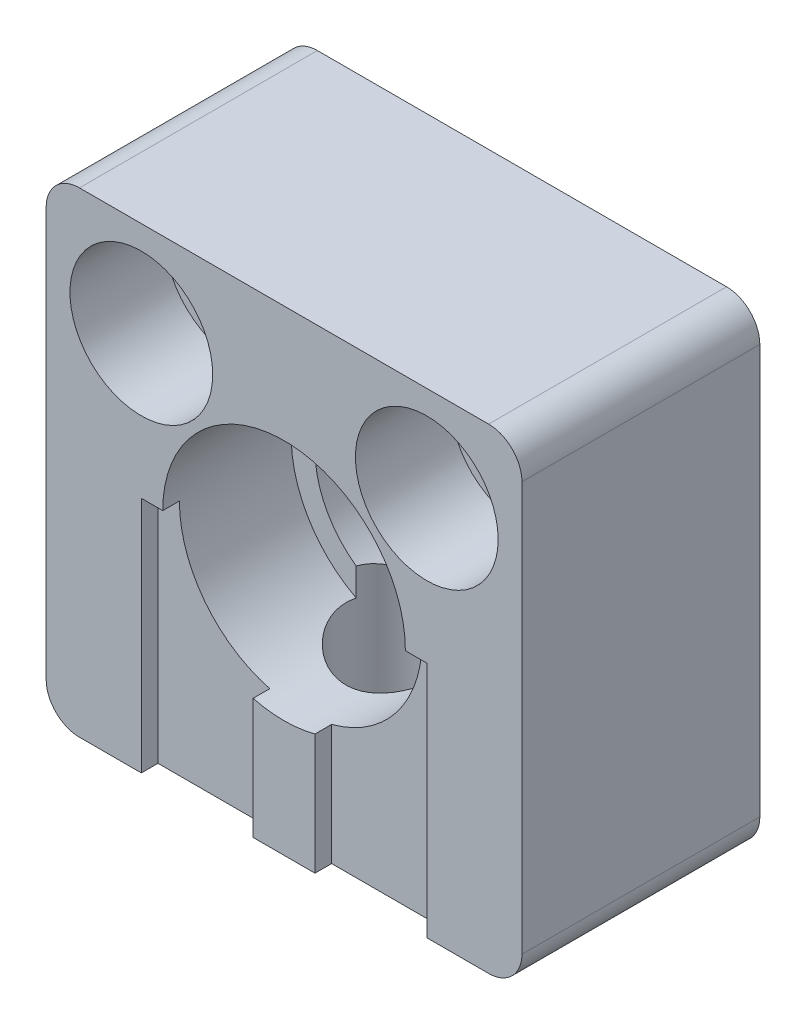
ISO-10303-21;
HEADER;
FILE_DESCRIPTION(('STEP AP214'),'2;1');
FILE_NAME('part.step','',(''),(''),'','','');
FILE_SCHEMA(('AUTOMOTIVE_DESIGN { 1 0 10303 214 1 1 1 1 }'));
ENDSEC;
DATA;
#1=APPLICATION_CONTEXT('core data for automotive mechanical design processes');
#2=APPLICATION_PROTOCOL_DEFINITION('international standard','automotive_design',2000,#1);
#3=PRODUCT_CONTEXT('',#1,'mechanical');
#4=PRODUCT('Part','Part','',(#3));
#5=PRODUCT_RELATED_PRODUCT_CATEGORY('part','',(#4));
#6=PRODUCT_DEFINITION_FORMATION('','',#4);
#7=PRODUCT_DEFINITION_CONTEXT('part definition',#1,'design');
#8=PRODUCT_DEFINITION('design','',#6,#7);
#9=PRODUCT_DEFINITION_SHAPE('','',#8);
#10=(LENGTH_UNIT() NAMED_UNIT(*) SI_UNIT(.MILLI.,.METRE.));
#11=(NAMED_UNIT(*) PLANE_ANGLE_UNIT() SI_UNIT($,.RADIAN.));
#12=(NAMED_UNIT(*) SI_UNIT($,.STERADIAN.) SOLID_ANGLE_UNIT());
#13=UNCERTAINTY_MEASURE_WITH_UNIT(LENGTH_MEASURE(1.E-05),#10,'distance_accuracy_value','');
#14=(GEOMETRIC_REPRESENTATION_CONTEXT(3) GLOBAL_UNCERTAINTY_ASSIGNED_CONTEXT((#13)) GLOBAL_UNIT_ASSIGNED_CONTEXT((#10,
#11,#12)) REPRESENTATION_CONTEXT('',''));
#15=CARTESIAN_POINT('',(0.,0.,0.));
#16=DIRECTION('',(0.,0.,1.));
#17=DIRECTION('',(1.,0.,0.));
#18=AXIS2_PLACEMENT_3D('',#15,#16,#17);
#19=CARTESIAN_POINT('',(0.,10.,0.));
#20=DIRECTION('',(0.,0.,-1.));
#21=DIRECTION('',(-1.,0.,0.));
#22=AXIS2_PLACEMENT_3D('',#19,#20,#21);
#23=PLANE('',#22);
#24=CARTESIAN_POINT('',(5.,5.,0.));
#25=DIRECTION('',(0.,0.,1.));
#26=DIRECTION('',(1.,0.,0.));
#27=AXIS2_PLACEMENT_3D('',#24,#25,#26);
#28=CIRCLE('',#27,2.55);
#29=CARTESIAN_POINT('',(4.35,2.53423439881242,0.));
#30=VERTEX_POINT('',#29);
#31=CARTESIAN_POINT('',(5.65,2.53423439881241,0.));
#32=VERTEX_POINT('',#31);
#33=EDGE_CURVE('E213',#30,#32,#28,.T.);
#34=ORIENTED_EDGE('',*,*,#33,.F.);
#35=DIRECTION('',(0.,-1.,0.));
#36=VECTOR('',#35,1.);
#37=CARTESIAN_POINT('',(4.35,5.,0.));
#38=LINE('',#37,#36);
#39=CARTESIAN_POINT('',(4.35,0.,0.));
#40=VERTEX_POINT('',#39);
#41=EDGE_CURVE('E356',#30,#40,#38,.T.);
#42=ORIENTED_EDGE('',*,*,#41,.T.);
#43=DIRECTION('',(1.,0.,0.));
#44=VECTOR('',#43,1.);
#45=CARTESIAN_POINT('',(0.,0.,0.));
#46=LINE('',#45,#44);
#47=CARTESIAN_POINT('',(5.65,0.,0.));
#48=VERTEX_POINT('',#47);
#49=EDGE_CURVE('E236',#40,#48,#46,.T.);
#50=ORIENTED_EDGE('',*,*,#49,.T.);
#51=DIRECTION('',(0.,-1.,0.));
#52=VECTOR('',#51,1.);
#53=CARTESIAN_POINT('',(5.65,5.,0.));
#54=LINE('',#53,#52);
#55=EDGE_CURVE('E358',#32,#48,#54,.T.);
#56=ORIENTED_EDGE('',*,*,#55,.F.);
#57=EDGE_LOOP('',(#34,#42,#50,#56));
#58=FACE_BOUND('',#57,.T.);
#59=ADVANCED_FACE('F41',(#58),#23,.F.);
#60=CARTESIAN_POINT('',(5.,5.,-5.));
#61=DIRECTION('',(0.,0.,1.));
#62=DIRECTION('',(1.,0.,0.));
#63=AXIS2_PLACEMENT_3D('',#60,#61,#62);
#64=CYLINDRICAL_SURFACE('',#63,2.05);
#65=CARTESIAN_POINT('',(5.,5.,-5.));
#66=DIRECTION('',(0.,0.,1.));
#67=DIRECTION('',(1.,0.,0.));
#68=AXIS2_PLACEMENT_3D('',#65,#66,#67);
#69=CIRCLE('',#68,2.05);
#70=CARTESIAN_POINT('',(7.05,5.,-5.));
#71=VERTEX_POINT('',#70);
#72=EDGE_CURVE('E210',#71,#71,#69,.T.);
#73=ORIENTED_EDGE('',*,*,#72,.F.);
#74=EDGE_LOOP('',(#73));
#75=FACE_BOUND('',#74,.T.);
#76=CARTESIAN_POINT('',(5.,5.,-2.7));
#77=DIRECTION('',(0.,0.,1.));
#78=DIRECTION('',(1.,0.,0.));
#79=AXIS2_PLACEMENT_3D('',#76,#77,#78);
#80=CIRCLE('',#79,2.05);
#81=CARTESIAN_POINT('',(3.81678404338007,3.32593309572168,-2.7));
#82=VERTEX_POINT('',#81);
#83=CARTESIAN_POINT('',(6.18321595661992,3.32593309572168,-2.7));
#84=VERTEX_POINT('',#83);
#85=EDGE_CURVE('E199',#82,#84,#80,.F.);
#86=ORIENTED_EDGE('',*,*,#85,.F.);
#87=CARTESIAN_POINT('',(3.81678404338007,3.32593309572168,-2.7));
#88=CARTESIAN_POINT('',(3.8278005513832,3.31819637087131,-2.765326153109));
#89=CARTESIAN_POINT('',(3.84414982967853,3.30674221042156,-2.8290238567388));
#90=CARTESIAN_POINT('',(3.88634350823016,3.27868034568624,-2.95157842140069));
#91=CARTESIAN_POINT('',(3.91212998426949,3.26210417424111,-3.01046218776406));
#92=CARTESIAN_POINT('',(3.97205384854045,3.22601284130932,-3.12237579844932));
#93=CARTESIAN_POINT('',(4.00615396119919,3.20651094392162,-3.17543028014982));
#94=CARTESIAN_POINT('',(4.08205812293609,3.16649760310382,-3.27545461243903));
#95=CARTESIAN_POINT('',(4.12387842801546,3.14598409765634,-3.32241126095398));
#96=CARTESIAN_POINT('',(4.21970311854194,3.10350812444375,-3.41434676297544));
#97=CARTESIAN_POINT('',(4.27455109054424,3.08164478685224,-3.45849888121909));
#98=CARTESIAN_POINT('',(4.39197741073161,3.04126174325901,-3.5369594053755));
#99=CARTESIAN_POINT('',(4.45455037185747,3.02273972910613,-3.57127461624787));
#100=CARTESIAN_POINT('',(4.58343886540771,2.99171858841217,-3.62748488661453));
#101=CARTESIAN_POINT('',(4.64951469369949,2.97901350166299,-3.64981052033027));
#102=CARTESIAN_POINT('',(4.785405542852,2.9601140665572,-3.68271705606529));
#103=CARTESIAN_POINT('',(4.85521621429097,2.95391231102052,-3.69331132067998));
#104=CARTESIAN_POINT('',(4.98649858408965,2.94913398124184,-3.70148117468234));
#105=CARTESIAN_POINT('',(5.0478464035154,2.94965408301915,-3.70059893012521));
#106=CARTESIAN_POINT('',(5.16940236075882,2.95610569745522,-3.68954813123977));
#107=CARTESIAN_POINT('',(5.22961061035164,2.96203667654881,-3.67938049254164));
#108=CARTESIAN_POINT('',(5.34486901231238,2.97840942528612,-3.65085087223723));
#109=CARTESIAN_POINT('',(5.40002851085772,2.98866870866627,-3.63281949736945));
#110=CARTESIAN_POINT('',(5.50649534489396,3.01280475020082,-3.58938987610756));
#111=CARTESIAN_POINT('',(5.55780224242739,3.02668191883114,-3.56399079375555));
#112=CARTESIAN_POINT('',(5.66017994967123,3.05840542624428,-3.50399039527991));
#113=CARTESIAN_POINT('',(5.71080614347555,3.07649777953474,-3.46876283989075));
#114=CARTESIAN_POINT('',(5.80579360139811,3.11431264344664,-3.39132458522398));
#115=CARTESIAN_POINT('',(5.85014605303552,3.13403738661233,-3.34910424054577));
#116=CARTESIAN_POINT('',(5.93722483263613,3.17606572040625,-3.25257237953394));
#117=CARTESIAN_POINT('',(5.97900288319121,3.19837365870926,-3.1974036506756));
#118=CARTESIAN_POINT('',(6.05273934419444,3.24044345845333,-3.08010313509779));
#119=CARTESIAN_POINT('',(6.08472164329113,3.26021144448357,-3.01798880019148));
#120=CARTESIAN_POINT('',(6.12760454884719,3.28786868374317,-2.91278217860742));
#121=CARTESIAN_POINT('',(6.14189120042985,3.29741081966582,-2.87148893752652));
#122=CARTESIAN_POINT('',(6.16599884104673,3.31383668010573,-2.78702726213335));
#123=CARTESIAN_POINT('',(6.17581101964317,3.32071515577708,-2.74385530999246));
#124=CARTESIAN_POINT('',(6.18321595661992,3.32593309572168,-2.7));
#125=B_SPLINE_CURVE_WITH_KNOTS('',3,(#87,#88,#89,#90,#91,#92,#93,#94,#95,#96,#97,#98,#99,#100,
#101,#102,#103,#104,#105,#106,#107,#108,#109,#110,#111,#112,#113,#114,#115,#116,#117,#118,#119,
#120,#121,#122,#123,#124),.UNSPECIFIED.,.F.,.F.,(4,2,2,2,2,2,2,2,2,2,2,2,2,2,2,2,2,2,4),(0.,
0.199365274451744,0.397526850947447,0.59481576957,0.79252494818478,1.01263259860537,
1.23258761382661,1.4440008930372,1.65517311382079,1.83829908234924,2.02140699482604,
2.19746416034397,2.37354130955218,2.56560943797557,2.75794473340479,2.97509773169923,
3.19171686885268,3.32557610106867,3.45969778191617),.UNSPECIFIED.);
#126=EDGE_CURVE('E294',#82,#84,#125,.T.);
#127=ORIENTED_EDGE('',*,*,#126,.T.);
#128=EDGE_LOOP('',(#86,#127));
#129=FACE_BOUND('',#128,.T.);
#130=ADVANCED_FACE('F305',(#75,#129),#64,.F.);
#131=CARTESIAN_POINT('',(0.,10.,0.));
#132=DIRECTION('',(1.,0.,0.));
#133=DIRECTION('',(0.,0.,-1.));
#134=AXIS2_PLACEMENT_3D('',#131,#132,#133);
#135=PLANE('',#134);
#136=DIRECTION('',(0.,-1.,0.));
#137=VECTOR('',#136,1.);
#138=CARTESIAN_POINT('',(0.,10.,-5.));
#139=LINE('',#138,#137);
#140=CARTESIAN_POINT('',(0.,9.3,-5.));
#141=VERTEX_POINT('',#140);
#142=CARTESIAN_POINT('',(0.,0.699999999999999,-5.));
#143=VERTEX_POINT('',#142);
#144=EDGE_CURVE('E232',#141,#143,#139,.T.);
#145=ORIENTED_EDGE('',*,*,#144,.T.);
#146=DIRECTION('',(0.,0.,1.));
#147=VECTOR('',#146,1.);
#148=CARTESIAN_POINT('',(0.,0.699999999999999,0.));
#149=LINE('',#148,#147);
#150=CARTESIAN_POINT('',(0.,0.699999999999999,0.));
#151=VERTEX_POINT('',#150);
#152=EDGE_CURVE('E673',#143,#151,#149,.T.);
#153=ORIENTED_EDGE('',*,*,#152,.T.);
#154=DIRECTION('',(0.,-1.,0.));
#155=VECTOR('',#154,1.);
#156=CARTESIAN_POINT('',(0.,10.,0.));
#157=LINE('',#156,#155);
#158=CARTESIAN_POINT('',(0.,9.3,0.));
#159=VERTEX_POINT('',#158);
#160=EDGE_CURVE('E250',#159,#151,#157,.T.);
#161=ORIENTED_EDGE('',*,*,#160,.F.);
#162=DIRECTION('',(0.,0.,1.));
#163=VECTOR('',#162,1.);
#164=CARTESIAN_POINT('',(0.,9.3,0.));
#165=LINE('',#164,#163);
#166=EDGE_CURVE('E191',#159,#141,#165,.F.);
#167=ORIENTED_EDGE('',*,*,#166,.T.);
#168=EDGE_LOOP('',(#145,#153,#161,#167));
#169=FACE_BOUND('',#168,.T.);
#170=ADVANCED_FACE('F309',(#169),#135,.F.);
#171=CARTESIAN_POINT('',(2.,8.,0.));
#172=DIRECTION('',(0.,0.,1.));
#173=DIRECTION('',(1.,0.,0.));
#174=AXIS2_PLACEMENT_3D('',#171,#172,#173);
#175=CIRCLE('',#174,1.5);
#176=CARTESIAN_POINT('',(3.5,8.,0.));
#177=VERTEX_POINT('',#176);
#178=EDGE_CURVE('E469',#177,#177,#175,.T.);
#179=ORIENTED_EDGE('',*,*,#178,.F.);
#180=EDGE_LOOP('',(#179));
#181=FACE_BOUND('',#180,.T.);
#182=CARTESIAN_POINT('',(8.,8.,0.));
#183=DIRECTION('',(0.,0.,1.));
#184=DIRECTION('',(1.,0.,0.));
#185=AXIS2_PLACEMENT_3D('',#182,#183,#184);
#186=CIRCLE('',#185,1.5);
#187=CARTESIAN_POINT('',(9.5,8.,0.));
#188=VERTEX_POINT('',#187);
#189=EDGE_CURVE('E302',#188,#188,#186,.T.);
#190=ORIENTED_EDGE('',*,*,#189,.F.);
#191=EDGE_LOOP('',(#190));
#192=FACE_BOUND('',#191,.T.);
#193=ORIENTED_EDGE('',*,*,#160,.T.);
#194=CARTESIAN_POINT('',(0.7,0.699999999999999,0.));
#195=DIRECTION('',(0.,0.,-1.));
#196=DIRECTION('',(-1.,0.,0.));
#197=AXIS2_PLACEMENT_3D('',#194,#195,#196);
#198=CIRCLE('',#197,0.7);
#199=CARTESIAN_POINT('',(0.7,0.,0.));
#200=VERTEX_POINT('',#199);
#201=EDGE_CURVE('E684',#151,#200,#198,.F.);
#202=ORIENTED_EDGE('',*,*,#201,.T.);
#203=CARTESIAN_POINT('',(2.,0.,0.));
#204=VERTEX_POINT('',#203);
#205=EDGE_CURVE('E233',#200,#204,#46,.T.);
#206=ORIENTED_EDGE('',*,*,#205,.T.);
#207=DIRECTION('',(0.,-1.,0.));
#208=VECTOR('',#207,1.);
#209=CARTESIAN_POINT('',(2.,5.,0.));
#210=LINE('',#209,#208);
#211=CARTESIAN_POINT('',(2.,5.,0.));
#212=VERTEX_POINT('',#211);
#213=EDGE_CURVE('E360',#212,#204,#210,.T.);
#214=ORIENTED_EDGE('',*,*,#213,.F.);
#215=DIRECTION('',(-1.,0.,0.));
#216=VECTOR('',#215,1.);
#217=CARTESIAN_POINT('',(2.,5.,0.));
#218=LINE('',#217,#216);
#219=CARTESIAN_POINT('',(2.45,5.,0.));
#220=VERTEX_POINT('',#219);
#221=EDGE_CURVE('E381',#220,#212,#218,.T.);
#222=ORIENTED_EDGE('',*,*,#221,.F.);
#223=CARTESIAN_POINT('',(7.55,5.,0.));
#224=VERTEX_POINT('',#223);
#225=EDGE_CURVE('E206',#224,#220,#28,.T.);
#226=ORIENTED_EDGE('',*,*,#225,.F.);
#227=DIRECTION('',(-1.,0.,0.));
#228=VECTOR('',#227,1.);
#229=CARTESIAN_POINT('',(5.65,5.,0.));
#230=LINE('',#229,#228);
#231=CARTESIAN_POINT('',(8.,5.,0.));
#232=VERTEX_POINT('',#231);
#233=EDGE_CURVE('E390',#232,#224,#230,.T.);
#234=ORIENTED_EDGE('',*,*,#233,.F.);
#235=DIRECTION('',(0.,-1.,0.));
#236=VECTOR('',#235,1.);
#237=CARTESIAN_POINT('',(8.,5.,0.));
#238=LINE('',#237,#236);
#239=CARTESIAN_POINT('',(8.,0.,0.));
#240=VERTEX_POINT('',#239);
#241=EDGE_CURVE('E406',#232,#240,#238,.T.);
#242=ORIENTED_EDGE('',*,*,#241,.T.);
#243=CARTESIAN_POINT('',(9.3,0.,0.));
#244=VERTEX_POINT('',#243);
#245=EDGE_CURVE('E222',#240,#244,#46,.T.);
#246=ORIENTED_EDGE('',*,*,#245,.T.);
#247=CARTESIAN_POINT('',(9.3,0.699999999999999,0.));
#248=DIRECTION('',(0.,0.,-1.));
#249=DIRECTION('',(-1.,0.,0.));
#250=AXIS2_PLACEMENT_3D('',#247,#248,#249);
#251=CIRCLE('',#250,0.7);
#252=CARTESIAN_POINT('',(10.,0.699999999999999,0.));
#253=VERTEX_POINT('',#252);
#254=EDGE_CURVE('E681',#244,#253,#251,.F.);
#255=ORIENTED_EDGE('',*,*,#254,.T.);
#256=DIRECTION('',(0.,-1.,0.));
#257=VECTOR('',#256,1.);
#258=CARTESIAN_POINT('',(10.,10.,0.));
#259=LINE('',#258,#257);
#260=CARTESIAN_POINT('',(10.,9.3,0.));
#261=VERTEX_POINT('',#260);
#262=EDGE_CURVE('E246',#261,#253,#259,.T.);
#263=ORIENTED_EDGE('',*,*,#262,.F.);
#264=CARTESIAN_POINT('',(9.3,9.3,0.));
#265=DIRECTION('',(0.,0.,-1.));
#266=DIRECTION('',(-1.,0.,0.));
#267=AXIS2_PLACEMENT_3D('',#264,#265,#266);
#268=CIRCLE('',#267,0.7);
#269=CARTESIAN_POINT('',(9.3,10.,0.));
#270=VERTEX_POINT('',#269);
#271=EDGE_CURVE('E678',#261,#270,#268,.F.);
#272=ORIENTED_EDGE('',*,*,#271,.T.);
#273=DIRECTION('',(1.,0.,0.));
#274=VECTOR('',#273,1.);
#275=CARTESIAN_POINT('',(0.,10.,0.));
#276=LINE('',#275,#274);
#277=CARTESIAN_POINT('',(0.7,10.,0.));
#278=VERTEX_POINT('',#277);
#279=EDGE_CURVE('E223',#278,#270,#276,.T.);
#280=ORIENTED_EDGE('',*,*,#279,.F.);
#281=CARTESIAN_POINT('',(0.7,9.3,0.));
#282=DIRECTION('',(0.,0.,-1.));
#283=DIRECTION('',(-1.,0.,0.));
#284=AXIS2_PLACEMENT_3D('',#281,#282,#283);
#285=CIRCLE('',#284,0.7);
#286=EDGE_CURVE('E676',#278,#159,#285,.F.);
#287=ORIENTED_EDGE('',*,*,#286,.T.);
#288=EDGE_LOOP('',(#193,#202,#206,#214,#222,#226,#234,#242,#246,#255,#263,#272,#280,#287));
#289=FACE_BOUND('',#288,.T.);
#290=ADVANCED_FACE('F326',(#181,#192,#289),#23,.F.);
#291=CARTESIAN_POINT('',(10.,10.,0.));
#292=DIRECTION('',(-1.,0.,0.));
#293=DIRECTION('',(0.,0.,1.));
#294=AXIS2_PLACEMENT_3D('',#291,#292,#293);
#295=PLANE('',#294);
#296=ORIENTED_EDGE('',*,*,#262,.T.);
#297=DIRECTION('',(0.,0.,-1.));
#298=VECTOR('',#297,1.);
#299=CARTESIAN_POINT('',(10.,0.699999999999999,-5.));
#300=LINE('',#299,#298);
#301=CARTESIAN_POINT('',(10.,0.699999999999999,-5.));
#302=VERTEX_POINT('',#301);
#303=EDGE_CURVE('E706',#253,#302,#300,.T.);
#304=ORIENTED_EDGE('',*,*,#303,.T.);
#305=DIRECTION('',(0.,-1.,0.));
#306=VECTOR('',#305,1.);
#307=CARTESIAN_POINT('',(10.,10.,-5.));
#308=LINE('',#307,#306);
#309=CARTESIAN_POINT('',(10.,9.3,-5.));
#310=VERTEX_POINT('',#309);
#311=EDGE_CURVE('E243',#310,#302,#308,.T.);
#312=ORIENTED_EDGE('',*,*,#311,.F.);
#313=DIRECTION('',(0.,0.,-1.));
#314=VECTOR('',#313,1.);
#315=CARTESIAN_POINT('',(10.,9.3,0.));
#316=LINE('',#315,#314);
#317=EDGE_CURVE('E703',#310,#261,#316,.F.);
#318=ORIENTED_EDGE('',*,*,#317,.T.);
#319=EDGE_LOOP('',(#296,#304,#312,#318));
#320=FACE_BOUND('',#319,.T.);
#321=ADVANCED_FACE('F322',(#320),#295,.F.);
#322=CARTESIAN_POINT('',(0.,10.,-5.));
#323=DIRECTION('',(0.,0.,1.));
#324=DIRECTION('',(1.,0.,0.));
#325=AXIS2_PLACEMENT_3D('',#322,#323,#324);
#326=PLANE('',#325);
#327=ORIENTED_EDGE('',*,*,#72,.T.);
#328=EDGE_LOOP('',(#327));
#329=FACE_BOUND('',#328,.T.);
#330=DIRECTION('',(-1.,0.,0.));
#331=VECTOR('',#330,1.);
#332=CARTESIAN_POINT('',(0.,0.,-5.));
#333=LINE('',#332,#331);
#334=CARTESIAN_POINT('',(9.3,0.,-5.));
#335=VERTEX_POINT('',#334);
#336=CARTESIAN_POINT('',(0.699999999999997,0.,-5.));
#337=VERTEX_POINT('',#336);
#338=EDGE_CURVE('E228',#335,#337,#333,.T.);
#339=ORIENTED_EDGE('',*,*,#338,.T.);
#340=CARTESIAN_POINT('',(0.699999999999997,0.699999999999999,-5.));
#341=DIRECTION('',(0.,0.,1.));
#342=DIRECTION('',(1.,0.,0.));
#343=AXIS2_PLACEMENT_3D('',#340,#341,#342);
#344=CIRCLE('',#343,0.7);
#345=EDGE_CURVE('E700',#337,#143,#344,.F.);
#346=ORIENTED_EDGE('',*,*,#345,.T.);
#347=ORIENTED_EDGE('',*,*,#144,.F.);
#348=CARTESIAN_POINT('',(0.699999999999997,9.3,-5.));
#349=DIRECTION('',(0.,0.,1.));
#350=DIRECTION('',(1.,0.,0.));
#351=AXIS2_PLACEMENT_3D('',#348,#349,#350);
#352=CIRCLE('',#351,0.7);
#353=CARTESIAN_POINT('',(0.699999999999997,10.,-5.));
#354=VERTEX_POINT('',#353);
#355=EDGE_CURVE('E693',#141,#354,#352,.F.);
#356=ORIENTED_EDGE('',*,*,#355,.T.);
#357=DIRECTION('',(-1.,0.,0.));
#358=VECTOR('',#357,1.);
#359=CARTESIAN_POINT('',(0.,10.,-5.));
#360=LINE('',#359,#358);
#361=CARTESIAN_POINT('',(9.3,10.,-5.));
#362=VERTEX_POINT('',#361);
#363=EDGE_CURVE('E227',#362,#354,#360,.T.);
#364=ORIENTED_EDGE('',*,*,#363,.F.);
#365=CARTESIAN_POINT('',(9.3,9.3,-5.));
#366=DIRECTION('',(0.,0.,1.));
#367=DIRECTION('',(1.,0.,0.));
#368=AXIS2_PLACEMENT_3D('',#365,#366,#367);
#369=CIRCLE('',#368,0.7);
#370=EDGE_CURVE('E65',#362,#310,#369,.F.);
#371=ORIENTED_EDGE('',*,*,#370,.T.);
#372=ORIENTED_EDGE('',*,*,#311,.T.);
#373=CARTESIAN_POINT('',(9.3,0.699999999999999,-5.));
#374=DIRECTION('',(0.,0.,1.));
#375=DIRECTION('',(1.,0.,0.));
#376=AXIS2_PLACEMENT_3D('',#373,#374,#375);
#377=CIRCLE('',#376,0.7);
#378=EDGE_CURVE('E57',#302,#335,#377,.F.);
#379=ORIENTED_EDGE('',*,*,#378,.T.);
#380=EDGE_LOOP('',(#339,#346,#347,#356,#364,#371,#372,#379));
#381=FACE_BOUND('',#380,.T.);
#382=ADVANCED_FACE('F315',(#329,#381),#326,.F.);
#383=CARTESIAN_POINT('',(0.,10.,0.));
#384=DIRECTION('',(0.,-1.,0.));
#385=DIRECTION('',(0.,0.,-1.));
#386=AXIS2_PLACEMENT_3D('',#383,#384,#385);
#387=PLANE('',#386);
#388=ORIENTED_EDGE('',*,*,#279,.T.);
#389=DIRECTION('',(0.,0.,-1.));
#390=VECTOR('',#389,1.);
#391=CARTESIAN_POINT('',(9.3,10.,0.));
#392=LINE('',#391,#390);
#393=EDGE_CURVE('E11',#270,#362,#392,.T.);
#394=ORIENTED_EDGE('',*,*,#393,.T.);
#395=ORIENTED_EDGE('',*,*,#363,.T.);
#396=DIRECTION('',(0.,0.,1.));
#397=VECTOR('',#396,1.);
#398=CARTESIAN_POINT('',(0.7,10.,0.));
#399=LINE('',#398,#397);
#400=EDGE_CURVE('E50',#354,#278,#399,.T.);
#401=ORIENTED_EDGE('',*,*,#400,.T.);
#402=EDGE_LOOP('',(#388,#394,#395,#401));
#403=FACE_BOUND('',#402,.T.);
#404=ADVANCED_FACE('F311',(#403),#387,.F.);
#405=CARTESIAN_POINT('',(0.,0.,0.));
#406=DIRECTION('',(0.,-1.,0.));
#407=DIRECTION('',(0.,0.,-1.));
#408=AXIS2_PLACEMENT_3D('',#405,#406,#407);
#409=PLANE('',#408);
#410=CARTESIAN_POINT('',(5.,0.,-2.5));
#411=DIRECTION('',(0.,-1.,0.));
#412=DIRECTION('',(0.,0.,-1.));
#413=AXIS2_PLACEMENT_3D('',#410,#411,#412);
#414=CIRCLE('',#413,1.2);
#415=CARTESIAN_POINT('',(5.,0.,-3.7));
#416=VERTEX_POINT('',#415);
#417=EDGE_CURVE('E201',#416,#416,#414,.T.);
#418=ORIENTED_EDGE('',*,*,#417,.F.);
#419=EDGE_LOOP('',(#418));
#420=FACE_BOUND('',#419,.T.);
#421=ORIENTED_EDGE('',*,*,#205,.F.);
#422=DIRECTION('',(0.,0.,1.));
#423=VECTOR('',#422,1.);
#424=CARTESIAN_POINT('',(0.699999999999997,0.,-5.));
#425=LINE('',#424,#423);
#426=EDGE_CURVE('E690',#200,#337,#425,.F.);
#427=ORIENTED_EDGE('',*,*,#426,.T.);
#428=ORIENTED_EDGE('',*,*,#338,.F.);
#429=DIRECTION('',(0.,0.,-1.));
#430=VECTOR('',#429,1.);
#431=CARTESIAN_POINT('',(9.3,0.,0.));
#432=LINE('',#431,#430);
#433=EDGE_CURVE('E687',#335,#244,#432,.F.);
#434=ORIENTED_EDGE('',*,*,#433,.T.);
#435=ORIENTED_EDGE('',*,*,#245,.F.);
#436=DIRECTION('',(0.,0.,1.));
#437=VECTOR('',#436,1.);
#438=CARTESIAN_POINT('',(8.,0.,0.));
#439=LINE('',#438,#437);
#440=CARTESIAN_POINT('',(8.,0.,-0.349999999999999));
#441=VERTEX_POINT('',#440);
#442=EDGE_CURVE('E386',#441,#240,#439,.T.);
#443=ORIENTED_EDGE('',*,*,#442,.F.);
#444=DIRECTION('',(1.,0.,0.));
#445=VECTOR('',#444,1.);
#446=CARTESIAN_POINT('',(5.65,0.,-0.349999999999999));
#447=LINE('',#446,#445);
#448=CARTESIAN_POINT('',(5.65,0.,-0.349999999999999));
#449=VERTEX_POINT('',#448);
#450=EDGE_CURVE('E397',#449,#441,#447,.T.);
#451=ORIENTED_EDGE('',*,*,#450,.F.);
#452=DIRECTION('',(0.,0.,-1.));
#453=VECTOR('',#452,1.);
#454=CARTESIAN_POINT('',(5.65,0.,0.));
#455=LINE('',#454,#453);
#456=EDGE_CURVE('E393',#48,#449,#455,.T.);
#457=ORIENTED_EDGE('',*,*,#456,.F.);
#458=ORIENTED_EDGE('',*,*,#49,.F.);
#459=DIRECTION('',(0.,0.,1.));
#460=VECTOR('',#459,1.);
#461=CARTESIAN_POINT('',(4.35,0.,0.));
#462=LINE('',#461,#460);
#463=CARTESIAN_POINT('',(4.35,0.,-0.35));
#464=VERTEX_POINT('',#463);
#465=EDGE_CURVE('E373',#464,#40,#462,.T.);
#466=ORIENTED_EDGE('',*,*,#465,.F.);
#467=DIRECTION('',(1.,0.,0.));
#468=VECTOR('',#467,1.);
#469=CARTESIAN_POINT('',(2.,0.,-0.35));
#470=LINE('',#469,#468);
#471=CARTESIAN_POINT('',(2.,0.,-0.35));
#472=VERTEX_POINT('',#471);
#473=EDGE_CURVE('E452',#472,#464,#470,.T.);
#474=ORIENTED_EDGE('',*,*,#473,.F.);
#475=DIRECTION('',(0.,0.,-1.));
#476=VECTOR('',#475,1.);
#477=CARTESIAN_POINT('',(2.,0.,0.));
#478=LINE('',#477,#476);
#479=EDGE_CURVE('E405',#204,#472,#478,.T.);
#480=ORIENTED_EDGE('',*,*,#479,.F.);
#481=EDGE_LOOP('',(#421,#427,#428,#434,#435,#443,#451,#457,#458,#466,#474,#480));
#482=FACE_BOUND('',#481,.T.);
#483=ADVANCED_FACE('F314',(#420,#482),#409,.T.);
#484=CARTESIAN_POINT('',(5.,5.,-2.7));
#485=DIRECTION('',(0.,0.,1.));
#486=DIRECTION('',(1.,0.,0.));
#487=AXIS2_PLACEMENT_3D('',#484,#485,#486);
#488=PLANE('',#487);
#489=DIRECTION('',(0.,-1.,0.));
#490=VECTOR('',#489,1.);
#491=CARTESIAN_POINT('',(3.81678404338007,3.5,-2.7));
#492=LINE('',#491,#490);
#493=CARTESIAN_POINT('',(3.81678404338007,2.7411286003847,-2.7));
#494=VERTEX_POINT('',#493);
#495=EDGE_CURVE('E186',#82,#494,#492,.T.);
#496=ORIENTED_EDGE('',*,*,#495,.F.);
#497=ORIENTED_EDGE('',*,*,#85,.T.);
#498=DIRECTION('',(0.,-1.,0.));
#499=VECTOR('',#498,1.);
#500=CARTESIAN_POINT('',(6.18321595661992,3.5,-2.7));
#501=LINE('',#500,#499);
#502=CARTESIAN_POINT('',(6.18321595661992,2.74112860038469,-2.7));
#503=VERTEX_POINT('',#502);
#504=EDGE_CURVE('E183',#503,#84,#501,.F.);
#505=ORIENTED_EDGE('',*,*,#504,.F.);
#506=CARTESIAN_POINT('',(5.,5.,-2.7));
#507=DIRECTION('',(0.,0.,1.));
#508=DIRECTION('',(1.,0.,0.));
#509=AXIS2_PLACEMENT_3D('',#506,#507,#508);
#510=CIRCLE('',#509,2.55);
#511=EDGE_CURVE('E197',#503,#494,#510,.T.);
#512=ORIENTED_EDGE('',*,*,#511,.T.);
#513=EDGE_LOOP('',(#496,#497,#505,#512));
#514=FACE_BOUND('',#513,.T.);
#515=ADVANCED_FACE('F196',(#514),#488,.T.);
#516=CARTESIAN_POINT('',(5.,5.,-2.7));
#517=DIRECTION('',(0.,0.,1.));
#518=DIRECTION('',(1.,0.,0.));
#519=AXIS2_PLACEMENT_3D('',#516,#517,#518);
#520=CYLINDRICAL_SURFACE('',#519,2.55);
#521=ORIENTED_EDGE('',*,*,#511,.F.);
#522=CARTESIAN_POINT('',(6.18321595661992,2.74112860038469,-2.7));
#523=CARTESIAN_POINT('',(6.18829316819163,2.74379143904389,-2.66996989187554));
#524=CARTESIAN_POINT('',(6.19223024274965,2.74587172654655,-2.63970772754621));
#525=CARTESIAN_POINT('',(6.19779140863631,2.74882067928318,-2.57891639244746));
#526=CARTESIAN_POINT('',(6.19941572024527,2.7496894599076,-2.54838724738546));
#527=CARTESIAN_POINT('',(6.20076697261842,2.75040692643224,-2.4569982700278));
#528=CARTESIAN_POINT('',(6.19702458745081,2.74839479418033,-2.39602643608096));
#529=CARTESIAN_POINT('',(6.1804220793389,2.73964916166885,-2.27572464962355));
#530=CARTESIAN_POINT('',(6.16756022304436,2.73291476384455,-2.21639501147523));
#531=CARTESIAN_POINT('',(6.13327159598385,2.71558296377189,-2.10083640105912));
#532=CARTESIAN_POINT('',(6.1118385855939,2.70498274778345,-2.04460972169027));
#533=CARTESIAN_POINT('',(6.06016623431096,2.68064883299906,-1.93441020386246));
#534=CARTESIAN_POINT('',(6.02962488986124,2.66681191615611,-1.88060267205584));
#535=CARTESIAN_POINT('',(5.96088469710589,2.63767196710418,-1.77854998792077));
#536=CARTESIAN_POINT('',(5.92268144901643,2.62236809515675,-1.73030805678056));
#537=CARTESIAN_POINT('',(5.83487839551982,2.59004322067801,-1.63536437838808));
#538=CARTESIAN_POINT('',(5.78449470345975,2.57301460230053,-1.58938660739266));
#539=CARTESIAN_POINT('',(5.67631081452379,2.54067316471192,-1.50639511770222));
#540=CARTESIAN_POINT('',(5.61851006561465,2.52536047337206,-1.46938206682189));
#541=CARTESIAN_POINT('',(5.49641142943405,2.49799907928903,-1.40530614586715));
#542=CARTESIAN_POINT('',(5.43207570606053,2.48597106795095,-1.37830598600568));
#543=CARTESIAN_POINT('',(5.29905059535572,2.46670742920727,-1.33576874283213));
#544=CARTESIAN_POINT('',(5.23036456645273,2.4594681531497,-1.32022293114742));
#545=CARTESIAN_POINT('',(5.09705715004463,2.45104945971921,-1.30220857584461));
#546=CARTESIAN_POINT('',(5.03260255915867,2.44939730279349,-1.29871927189024));
#547=CARTESIAN_POINT('',(4.9040372304332,2.45099629225583,-1.30211723118927));
#548=CARTESIAN_POINT('',(4.83992641856232,2.45424633661391,-1.30900216228225));
#549=CARTESIAN_POINT('',(4.71701199960246,2.46503475126138,-1.33224706833917));
#550=CARTESIAN_POINT('',(4.65810077206881,2.47236315924021,-1.34814379359548));
#551=CARTESIAN_POINT('',(4.54383389877445,2.49046583597635,-1.38843142721025));
#552=CARTESIAN_POINT('',(4.48847877008191,2.50124060448986,-1.41282356753314));
#553=CARTESIAN_POINT('',(4.3797522474604,2.52592248708246,-1.47078596898919));
#554=CARTESIAN_POINT('',(4.32662857142169,2.53996200727747,-1.50476311442032));
#555=CARTESIAN_POINT('',(4.22657695548098,2.56955889972376,-1.58035157361301));
#556=CARTESIAN_POINT('',(4.1796530085044,2.58511723906128,-1.62196776646881));
#557=CARTESIAN_POINT('',(4.08903274215182,2.61774117340748,-1.71593083647889));
#558=CARTESIAN_POINT('',(4.0459830904307,2.6348190026799,-1.76889951759866));
#559=CARTESIAN_POINT('',(3.96926576349816,2.66722794430286,-1.88174401055498));
#560=CARTESIAN_POINT('',(3.93559827903137,2.68255902113721,-1.94161996278516));
#561=CARTESIAN_POINT('',(3.87859878080138,2.70959271804674,-2.06728690448914));
#562=CARTESIAN_POINT('',(3.85531970689839,2.72127666343485,-2.13310618176044));
#563=CARTESIAN_POINT('',(3.8204845221179,2.73910727490591,-2.26846749215396));
#564=CARTESIAN_POINT('',(3.80891060327298,2.74526235088994,-2.3380037001923));
#565=CARTESIAN_POINT('',(3.79978415727265,2.75011092976567,-2.45677082241404));
#566=CARTESIAN_POINT('',(3.79902706679421,2.75051014073305,-2.50571125938353));
#567=CARTESIAN_POINT('',(3.80345023795476,2.74816951488865,-2.60330692537571));
#568=CARTESIAN_POINT('',(3.80863767625874,2.74542588381226,-2.65196173823015));
#569=CARTESIAN_POINT('',(3.81678404338007,2.7411286003847,-2.7));
#570=B_SPLINE_CURVE_WITH_KNOTS('',3,(#522,#523,#524,#525,#526,#527,#528,#529,#530,#531,#532,
#533,#534,#535,#536,#537,#538,#539,#540,#541,#542,#543,#544,#545,#546,#547,#548,#549,#550,#551,
#552,#553,#554,#555,#556,#557,#558,#559,#560,#561,#562,#563,#564,#565,#566,#567,#568,#569),
.UNSPECIFIED.,.F.,.F.,(4,2,2,2,2,2,2,2,2,2,2,2,2,2,2,2,2,2,2,2,2,2,2,4),(0.,0.0916643145149473,
0.183319897829913,0.365695525416704,0.548105826681842,0.730649161333755,0.920086248634373,
1.10963243167795,1.31956931547493,1.52952183342897,1.74076791344525,1.95185285405955,
2.1445590710365,2.33722197351697,2.52077807485965,2.70436080572053,2.8973679112164,
3.09049872289855,3.30061255623376,3.51073066098719,3.72190764052295,3.93276285450162,
4.07916462610753,4.22574333089109),.UNSPECIFIED.);
#571=EDGE_CURVE('E180',#503,#494,#570,.T.);
#572=ORIENTED_EDGE('',*,*,#571,.T.);
#573=EDGE_LOOP('',(#521,#572));
#574=FACE_BOUND('',#573,.T.);
#575=CARTESIAN_POINT('',(5.,5.,-0.35));
#576=DIRECTION('',(0.,0.,-1.));
#577=DIRECTION('',(-1.,0.,0.));
#578=AXIS2_PLACEMENT_3D('',#575,#576,#577);
#579=CIRCLE('',#578,2.55);
#580=CARTESIAN_POINT('',(2.45,5.,-0.35));
#581=VERTEX_POINT('',#580);
#582=CARTESIAN_POINT('',(4.35,2.53423439881241,-0.35));
#583=VERTEX_POINT('',#582);
#584=EDGE_CURVE('E268',#581,#583,#579,.F.);
#585=ORIENTED_EDGE('',*,*,#584,.T.);
#586=DIRECTION('',(0.,0.,1.));
#587=VECTOR('',#586,1.);
#588=CARTESIAN_POINT('',(4.34999999999997,2.53423439881242,-2.69999999999999));
#589=LINE('',#588,#587);
#590=EDGE_CURVE('E192',#583,#30,#589,.T.);
#591=ORIENTED_EDGE('',*,*,#590,.T.);
#592=ORIENTED_EDGE('',*,*,#33,.T.);
#593=DIRECTION('',(0.,0.,1.));
#594=VECTOR('',#593,1.);
#595=CARTESIAN_POINT('',(5.65,2.53423439881241,-2.7));
#596=LINE('',#595,#594);
#597=CARTESIAN_POINT('',(5.65,2.53423439881241,-0.35));
#598=VERTEX_POINT('',#597);
#599=EDGE_CURVE('E261',#32,#598,#596,.F.);
#600=ORIENTED_EDGE('',*,*,#599,.T.);
#601=CARTESIAN_POINT('',(5.,5.,-0.35));
#602=DIRECTION('',(0.,0.,-1.));
#603=DIRECTION('',(-1.,0.,0.));
#604=AXIS2_PLACEMENT_3D('',#601,#602,#603);
#605=CIRCLE('',#604,2.55);
#606=CARTESIAN_POINT('',(7.55,5.,-0.349999999999999));
#607=VERTEX_POINT('',#606);
#608=EDGE_CURVE('E257',#598,#607,#605,.F.);
#609=ORIENTED_EDGE('',*,*,#608,.T.);
#610=DIRECTION('',(0.,0.,1.));
#611=VECTOR('',#610,1.);
#612=CARTESIAN_POINT('',(7.55,5.,-2.7));
#613=LINE('',#612,#611);
#614=EDGE_CURVE('E253',#224,#607,#613,.F.);
#615=ORIENTED_EDGE('',*,*,#614,.F.);
#616=ORIENTED_EDGE('',*,*,#225,.T.);
#617=DIRECTION('',(0.,0.,1.));
#618=VECTOR('',#617,1.);
#619=CARTESIAN_POINT('',(2.45,5.,-2.7));
#620=LINE('',#619,#618);
#621=EDGE_CURVE('E265',#581,#220,#620,.T.);
#622=ORIENTED_EDGE('',*,*,#621,.F.);
#623=EDGE_LOOP('',(#585,#591,#592,#600,#609,#615,#616,#622));
#624=FACE_BOUND('',#623,.T.);
#625=ADVANCED_FACE('F203',(#574,#624),#520,.F.);
#626=CARTESIAN_POINT('',(5.65,5.,0.));
#627=DIRECTION('',(-1.,0.,0.));
#628=DIRECTION('',(0.,0.,1.));
#629=AXIS2_PLACEMENT_3D('',#626,#627,#628);
#630=PLANE('',#629);
#631=ORIENTED_EDGE('',*,*,#55,.T.);
#632=ORIENTED_EDGE('',*,*,#456,.T.);
#633=DIRECTION('',(0.,-1.,0.));
#634=VECTOR('',#633,1.);
#635=CARTESIAN_POINT('',(5.65,5.,-0.349999999999999));
#636=LINE('',#635,#634);
#637=EDGE_CURVE('E216',#598,#449,#636,.T.);
#638=ORIENTED_EDGE('',*,*,#637,.F.);
#639=ORIENTED_EDGE('',*,*,#599,.F.);
#640=EDGE_LOOP('',(#631,#632,#638,#639));
#641=FACE_BOUND('',#640,.T.);
#642=ADVANCED_FACE('F423',(#641),#630,.F.);
#643=CARTESIAN_POINT('',(5.65,5.,-0.349999999999999));
#644=DIRECTION('',(0.,0.,-1.));
#645=DIRECTION('',(-1.,0.,0.));
#646=AXIS2_PLACEMENT_3D('',#643,#644,#645);
#647=PLANE('',#646);
#648=ORIENTED_EDGE('',*,*,#637,.T.);
#649=ORIENTED_EDGE('',*,*,#450,.T.);
#650=DIRECTION('',(0.,-1.,0.));
#651=VECTOR('',#650,1.);
#652=CARTESIAN_POINT('',(8.,5.,-0.349999999999999));
#653=LINE('',#652,#651);
#654=CARTESIAN_POINT('',(8.,5.,-0.349999999999999));
#655=VERTEX_POINT('',#654);
#656=EDGE_CURVE('E409',#655,#441,#653,.T.);
#657=ORIENTED_EDGE('',*,*,#656,.F.);
#658=DIRECTION('',(1.,0.,0.));
#659=VECTOR('',#658,1.);
#660=CARTESIAN_POINT('',(5.65,5.,-0.349999999999999));
#661=LINE('',#660,#659);
#662=EDGE_CURVE('E382',#607,#655,#661,.T.);
#663=ORIENTED_EDGE('',*,*,#662,.F.);
#664=ORIENTED_EDGE('',*,*,#608,.F.);
#665=EDGE_LOOP('',(#648,#649,#657,#663,#664));
#666=FACE_BOUND('',#665,.T.);
#667=ADVANCED_FACE('F417',(#666),#647,.F.);
#668=CARTESIAN_POINT('',(0.,5.,0.));
#669=DIRECTION('',(0.,-1.,0.));
#670=DIRECTION('',(0.,0.,-1.));
#671=AXIS2_PLACEMENT_3D('',#668,#669,#670);
#672=PLANE('',#671);
#673=ORIENTED_EDGE('',*,*,#614,.T.);
#674=ORIENTED_EDGE('',*,*,#662,.T.);
#675=DIRECTION('',(0.,0.,1.));
#676=VECTOR('',#675,1.);
#677=CARTESIAN_POINT('',(8.,5.,0.));
#678=LINE('',#677,#676);
#679=EDGE_CURVE('E385',#655,#232,#678,.T.);
#680=ORIENTED_EDGE('',*,*,#679,.T.);
#681=ORIENTED_EDGE('',*,*,#233,.T.);
#682=EDGE_LOOP('',(#673,#674,#680,#681));
#683=FACE_BOUND('',#682,.T.);
#684=ADVANCED_FACE('F436',(#683),#672,.T.);
#685=CARTESIAN_POINT('',(8.,5.,0.));
#686=DIRECTION('',(1.,0.,0.));
#687=DIRECTION('',(0.,0.,-1.));
#688=AXIS2_PLACEMENT_3D('',#685,#686,#687);
#689=PLANE('',#688);
#690=ORIENTED_EDGE('',*,*,#442,.T.);
#691=ORIENTED_EDGE('',*,*,#241,.F.);
#692=ORIENTED_EDGE('',*,*,#679,.F.);
#693=ORIENTED_EDGE('',*,*,#656,.T.);
#694=EDGE_LOOP('',(#690,#691,#692,#693));
#695=FACE_BOUND('',#694,.T.);
#696=ADVANCED_FACE('F428',(#695),#689,.F.);
#697=CARTESIAN_POINT('',(4.35,5.,0.));
#698=DIRECTION('',(1.,0.,0.));
#699=DIRECTION('',(0.,0.,-1.));
#700=AXIS2_PLACEMENT_3D('',#697,#698,#699);
#701=PLANE('',#700);
#702=DIRECTION('',(0.,-1.,0.));
#703=VECTOR('',#702,1.);
#704=CARTESIAN_POINT('',(4.35,5.,-0.35));
#705=LINE('',#704,#703);
#706=EDGE_CURVE('E370',#583,#464,#705,.T.);
#707=ORIENTED_EDGE('',*,*,#706,.T.);
#708=ORIENTED_EDGE('',*,*,#465,.T.);
#709=ORIENTED_EDGE('',*,*,#41,.F.);
#710=ORIENTED_EDGE('',*,*,#590,.F.);
#711=EDGE_LOOP('',(#707,#708,#709,#710));
#712=FACE_BOUND('',#711,.T.);
#713=ADVANCED_FACE('F497',(#712),#701,.F.);
#714=CARTESIAN_POINT('',(2.,5.,-0.35));
#715=DIRECTION('',(0.,0.,-1.));
#716=DIRECTION('',(-1.,0.,0.));
#717=AXIS2_PLACEMENT_3D('',#714,#715,#716);
#718=PLANE('',#717);
#719=DIRECTION('',(1.,0.,0.));
#720=VECTOR('',#719,1.);
#721=CARTESIAN_POINT('',(2.,5.,-0.35));
#722=LINE('',#721,#720);
#723=CARTESIAN_POINT('',(2.,5.,-0.35));
#724=VERTEX_POINT('',#723);
#725=EDGE_CURVE('E443',#724,#581,#722,.T.);
#726=ORIENTED_EDGE('',*,*,#725,.F.);
#727=DIRECTION('',(0.,-1.,0.));
#728=VECTOR('',#727,1.);
#729=CARTESIAN_POINT('',(2.,5.,-0.35));
#730=LINE('',#729,#728);
#731=EDGE_CURVE('E378',#724,#472,#730,.T.);
#732=ORIENTED_EDGE('',*,*,#731,.T.);
#733=ORIENTED_EDGE('',*,*,#473,.T.);
#734=ORIENTED_EDGE('',*,*,#706,.F.);
#735=ORIENTED_EDGE('',*,*,#584,.F.);
#736=EDGE_LOOP('',(#726,#732,#733,#734,#735));
#737=FACE_BOUND('',#736,.T.);
#738=ADVANCED_FACE('F496',(#737),#718,.F.);
#739=CARTESIAN_POINT('',(0.,5.,0.));
#740=DIRECTION('',(0.,-1.,0.));
#741=DIRECTION('',(0.,0.,-1.));
#742=AXIS2_PLACEMENT_3D('',#739,#740,#741);
#743=PLANE('',#742);
#744=ORIENTED_EDGE('',*,*,#621,.T.);
#745=ORIENTED_EDGE('',*,*,#221,.T.);
#746=DIRECTION('',(0.,0.,-1.));
#747=VECTOR('',#746,1.);
#748=CARTESIAN_POINT('',(2.,5.,0.));
#749=LINE('',#748,#747);
#750=EDGE_CURVE('E447',#212,#724,#749,.T.);
#751=ORIENTED_EDGE('',*,*,#750,.T.);
#752=ORIENTED_EDGE('',*,*,#725,.T.);
#753=EDGE_LOOP('',(#744,#745,#751,#752));
#754=FACE_BOUND('',#753,.T.);
#755=ADVANCED_FACE('F440',(#754),#743,.T.);
#756=CARTESIAN_POINT('',(2.,5.,0.));
#757=DIRECTION('',(-1.,0.,0.));
#758=DIRECTION('',(0.,0.,1.));
#759=AXIS2_PLACEMENT_3D('',#756,#757,#758);
#760=PLANE('',#759);
#761=ORIENTED_EDGE('',*,*,#479,.T.);
#762=ORIENTED_EDGE('',*,*,#731,.F.);
#763=ORIENTED_EDGE('',*,*,#750,.F.);
#764=ORIENTED_EDGE('',*,*,#213,.T.);
#765=EDGE_LOOP('',(#761,#762,#763,#764));
#766=FACE_BOUND('',#765,.T.);
#767=ADVANCED_FACE('F492',(#766),#760,.F.);
#768=CARTESIAN_POINT('',(8.,8.,-2.));
#769=DIRECTION('',(0.,0.,1.));
#770=DIRECTION('',(1.,0.,0.));
#771=AXIS2_PLACEMENT_3D('',#768,#769,#770);
#772=CYLINDRICAL_SURFACE('',#771,1.5);
#773=CARTESIAN_POINT('',(8.,8.,-2.));
#774=DIRECTION('',(0.,0.,1.));
#775=DIRECTION('',(1.,0.,0.));
#776=AXIS2_PLACEMENT_3D('',#773,#774,#775);
#777=CIRCLE('',#776,1.5);
#778=CARTESIAN_POINT('',(9.5,8.,-2.));
#779=VERTEX_POINT('',#778);
#780=EDGE_CURVE('E466',#779,#779,#777,.T.);
#781=ORIENTED_EDGE('',*,*,#780,.F.);
#782=EDGE_LOOP('',(#781));
#783=FACE_BOUND('',#782,.T.);
#784=ORIENTED_EDGE('',*,*,#189,.T.);
#785=EDGE_LOOP('',(#784));
#786=FACE_BOUND('',#785,.T.);
#787=ADVANCED_FACE('F486',(#783,#786),#772,.F.);
#788=CARTESIAN_POINT('',(8.,8.,-2.));
#789=DIRECTION('',(0.,0.,1.));
#790=DIRECTION('',(1.,0.,0.));
#791=AXIS2_PLACEMENT_3D('',#788,#789,#790);
#792=PLANE('',#791);
#793=ORIENTED_EDGE('',*,*,#780,.T.);
#794=EDGE_LOOP('',(#793));
#795=FACE_BOUND('',#794,.T.);
#796=ADVANCED_FACE('F481',(#795),#792,.T.);
#797=CARTESIAN_POINT('',(2.,8.,-2.));
#798=DIRECTION('',(0.,0.,1.));
#799=DIRECTION('',(1.,0.,0.));
#800=AXIS2_PLACEMENT_3D('',#797,#798,#799);
#801=CYLINDRICAL_SURFACE('',#800,1.5);
#802=CARTESIAN_POINT('',(2.,8.,-2.));
#803=DIRECTION('',(0.,0.,1.));
#804=DIRECTION('',(1.,0.,0.));
#805=AXIS2_PLACEMENT_3D('',#802,#803,#804);
#806=CIRCLE('',#805,1.5);
#807=CARTESIAN_POINT('',(3.5,8.,-2.));
#808=VERTEX_POINT('',#807);
#809=EDGE_CURVE('E303',#808,#808,#806,.T.);
#810=ORIENTED_EDGE('',*,*,#809,.F.);
#811=EDGE_LOOP('',(#810));
#812=FACE_BOUND('',#811,.T.);
#813=ORIENTED_EDGE('',*,*,#178,.T.);
#814=EDGE_LOOP('',(#813));
#815=FACE_BOUND('',#814,.T.);
#816=ADVANCED_FACE('F479',(#812,#815),#801,.F.);
#817=CARTESIAN_POINT('',(2.,8.,-2.));
#818=DIRECTION('',(0.,0.,1.));
#819=DIRECTION('',(1.,0.,0.));
#820=AXIS2_PLACEMENT_3D('',#817,#818,#819);
#821=PLANE('',#820);
#822=ORIENTED_EDGE('',*,*,#809,.T.);
#823=EDGE_LOOP('',(#822));
#824=FACE_BOUND('',#823,.T.);
#825=ADVANCED_FACE('F289',(#824),#821,.T.);
#826=CARTESIAN_POINT('',(5.,3.5,-2.5));
#827=DIRECTION('',(0.,-1.,0.));
#828=DIRECTION('',(0.,0.,-1.));
#829=AXIS2_PLACEMENT_3D('',#826,#827,#828);
#830=CYLINDRICAL_SURFACE('',#829,1.2);
#831=ORIENTED_EDGE('',*,*,#417,.T.);
#832=EDGE_LOOP('',(#831));
#833=FACE_BOUND('',#832,.T.);
#834=ORIENTED_EDGE('',*,*,#495,.T.);
#835=ORIENTED_EDGE('',*,*,#571,.F.);
#836=ORIENTED_EDGE('',*,*,#504,.T.);
#837=ORIENTED_EDGE('',*,*,#126,.F.);
#838=EDGE_LOOP('',(#834,#835,#836,#837));
#839=FACE_BOUND('',#838,.T.);
#840=ADVANCED_FACE('F182',(#833,#839),#830,.F.);
#841=CARTESIAN_POINT('',(0.7,0.699999999999999,0.));
#842=DIRECTION('',(0.,0.,-1.));
#843=DIRECTION('',(-1.,0.,0.));
#844=AXIS2_PLACEMENT_3D('',#841,#842,#843);
#845=CYLINDRICAL_SURFACE('',#844,0.7);
#846=ORIENTED_EDGE('',*,*,#345,.F.);
#847=ORIENTED_EDGE('',*,*,#426,.F.);
#848=ORIENTED_EDGE('',*,*,#201,.F.);
#849=ORIENTED_EDGE('',*,*,#152,.F.);
#850=EDGE_LOOP('',(#846,#847,#848,#849));
#851=FACE_BOUND('',#850,.T.);
#852=ADVANCED_FACE('F288',(#851),#845,.T.);
#853=CARTESIAN_POINT('',(9.3,0.699999999999999,0.));
#854=DIRECTION('',(0.,0.,1.));
#855=DIRECTION('',(1.,0.,0.));
#856=AXIS2_PLACEMENT_3D('',#853,#854,#855);
#857=CYLINDRICAL_SURFACE('',#856,0.7);
#858=ORIENTED_EDGE('',*,*,#254,.F.);
#859=ORIENTED_EDGE('',*,*,#433,.F.);
#860=ORIENTED_EDGE('',*,*,#378,.F.);
#861=ORIENTED_EDGE('',*,*,#303,.F.);
#862=EDGE_LOOP('',(#858,#859,#860,#861));
#863=FACE_BOUND('',#862,.T.);
#864=ADVANCED_FACE('F336',(#863),#857,.T.);
#865=CARTESIAN_POINT('',(9.3,9.3,0.));
#866=DIRECTION('',(0.,0.,-1.));
#867=DIRECTION('',(-1.,0.,0.));
#868=AXIS2_PLACEMENT_3D('',#865,#866,#867);
#869=CYLINDRICAL_SURFACE('',#868,0.7);
#870=ORIENTED_EDGE('',*,*,#271,.F.);
#871=ORIENTED_EDGE('',*,*,#317,.F.);
#872=ORIENTED_EDGE('',*,*,#370,.F.);
#873=ORIENTED_EDGE('',*,*,#393,.F.);
#874=EDGE_LOOP('',(#870,#871,#872,#873));
#875=FACE_BOUND('',#874,.T.);
#876=ADVANCED_FACE('F339',(#875),#869,.T.);
#877=CARTESIAN_POINT('',(0.7,9.3,0.));
#878=DIRECTION('',(0.,0.,1.));
#879=DIRECTION('',(1.,0.,0.));
#880=AXIS2_PLACEMENT_3D('',#877,#878,#879);
#881=CYLINDRICAL_SURFACE('',#880,0.7);
#882=ORIENTED_EDGE('',*,*,#355,.F.);
#883=ORIENTED_EDGE('',*,*,#166,.F.);
#884=ORIENTED_EDGE('',*,*,#286,.F.);
#885=ORIENTED_EDGE('',*,*,#400,.F.);
#886=EDGE_LOOP('',(#882,#883,#884,#885));
#887=FACE_BOUND('',#886,.T.);
#888=ADVANCED_FACE('F43',(#887),#881,.T.);
#889=CLOSED_SHELL('',(#59,#130,#170,#290,#321,#382,#404,#483,#515,#625,#642,#667,#684,#696,#713,
#738,#755,#767,#787,#796,#816,#825,#840,#852,#864,#876,#888));
#890=MANIFOLD_SOLID_BREP('B2',#889);
#891=ADVANCED_BREP_SHAPE_REPRESENTATION('',(#18,#890),#14);
#892=SHAPE_DEFINITION_REPRESENTATION(#9,#891);
ENDSEC;
END-ISO-10303-21;
